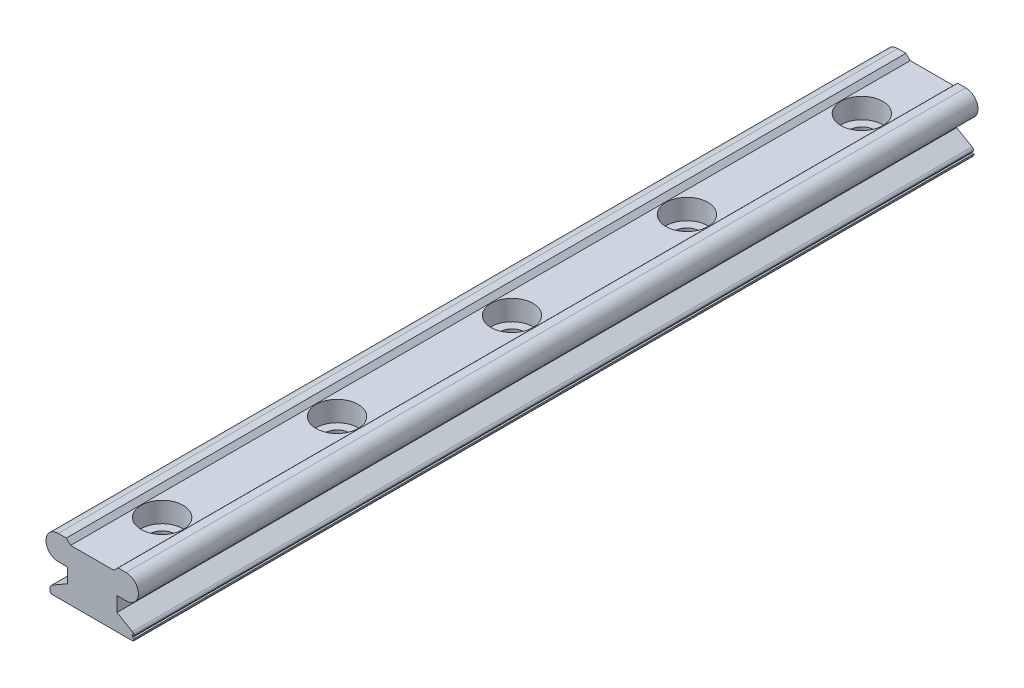
ISO-10303-21;
HEADER;
FILE_DESCRIPTION(('STEP AP214'),'2;1');
FILE_NAME('part.step','',(''),(''),'','','');
FILE_SCHEMA(('AUTOMOTIVE_DESIGN { 1 0 10303 214 1 1 1 1 }'));
ENDSEC;
DATA;
#1=APPLICATION_CONTEXT('core data for automotive mechanical design processes');
#2=APPLICATION_PROTOCOL_DEFINITION('international standard','automotive_design',2000,#1);
#3=PRODUCT_CONTEXT('',#1,'mechanical');
#4=PRODUCT('Part','Part','',(#3));
#5=PRODUCT_RELATED_PRODUCT_CATEGORY('part','',(#4));
#6=PRODUCT_DEFINITION_FORMATION('','',#4);
#7=PRODUCT_DEFINITION_CONTEXT('part definition',#1,'design');
#8=PRODUCT_DEFINITION('design','',#6,#7);
#9=PRODUCT_DEFINITION_SHAPE('','',#8);
#10=(LENGTH_UNIT() NAMED_UNIT(*) SI_UNIT(.MILLI.,.METRE.));
#11=(NAMED_UNIT(*) PLANE_ANGLE_UNIT() SI_UNIT($,.RADIAN.));
#12=(NAMED_UNIT(*) SI_UNIT($,.STERADIAN.) SOLID_ANGLE_UNIT());
#13=UNCERTAINTY_MEASURE_WITH_UNIT(LENGTH_MEASURE(1.E-05),#10,'distance_accuracy_value','');
#14=(GEOMETRIC_REPRESENTATION_CONTEXT(3) GLOBAL_UNCERTAINTY_ASSIGNED_CONTEXT((#13)) GLOBAL_UNIT_ASSIGNED_CONTEXT((#10,
#11,#12)) REPRESENTATION_CONTEXT('',''));
#15=CARTESIAN_POINT('',(0.,0.,0.));
#16=DIRECTION('',(0.,0.,1.));
#17=DIRECTION('',(1.,0.,0.));
#18=AXIS2_PLACEMENT_3D('',#15,#16,#17);
#19=CARTESIAN_POINT('',(5.746,0.,60.));
#20=DIRECTION('',(0.,1.,0.));
#21=DIRECTION('',(0.,0.,1.));
#22=AXIS2_PLACEMENT_3D('',#19,#20,#21);
#23=PLANE('',#22);
#24=CARTESIAN_POINT('',(0.,0.,-25.));
#25=DIRECTION('',(0.,-1.,0.));
#26=DIRECTION('',(0.,0.,-1.));
#27=AXIS2_PLACEMENT_3D('',#24,#25,#26);
#28=CIRCLE('',#27,1.75);
#29=CARTESIAN_POINT('',(0.,0.,-26.75));
#30=VERTEX_POINT('',#29);
#31=EDGE_CURVE('E317',#30,#30,#28,.T.);
#32=ORIENTED_EDGE('',*,*,#31,.F.);
#33=EDGE_LOOP('',(#32));
#34=FACE_BOUND('',#33,.T.);
#35=CARTESIAN_POINT('',(0.,0.,25.));
#36=DIRECTION('',(0.,-1.,0.));
#37=DIRECTION('',(0.,0.,-1.));
#38=AXIS2_PLACEMENT_3D('',#35,#36,#37);
#39=CIRCLE('',#38,1.75);
#40=CARTESIAN_POINT('',(0.,0.,23.25));
#41=VERTEX_POINT('',#40);
#42=EDGE_CURVE('E309',#41,#41,#39,.T.);
#43=ORIENTED_EDGE('',*,*,#42,.F.);
#44=EDGE_LOOP('',(#43));
#45=FACE_BOUND('',#44,.T.);
#46=DIRECTION('',(1.,0.,0.));
#47=VECTOR('',#46,1.);
#48=CARTESIAN_POINT('',(5.746,0.,-60.));
#49=LINE('',#48,#47);
#50=CARTESIAN_POINT('',(-5.746,0.,-60.));
#51=VERTEX_POINT('',#50);
#52=CARTESIAN_POINT('',(5.746,0.,-60.));
#53=VERTEX_POINT('',#52);
#54=EDGE_CURVE('E228',#51,#53,#49,.T.);
#55=ORIENTED_EDGE('',*,*,#54,.T.);
#56=DIRECTION('',(0.,0.,-1.));
#57=VECTOR('',#56,1.);
#58=CARTESIAN_POINT('',(5.746,0.,60.));
#59=LINE('',#58,#57);
#60=CARTESIAN_POINT('',(5.746,0.,60.));
#61=VERTEX_POINT('',#60);
#62=EDGE_CURVE('E278',#61,#53,#59,.T.);
#63=ORIENTED_EDGE('',*,*,#62,.F.);
#64=DIRECTION('',(1.,0.,0.));
#65=VECTOR('',#64,1.);
#66=CARTESIAN_POINT('',(5.746,0.,60.));
#67=LINE('',#66,#65);
#68=CARTESIAN_POINT('',(-5.746,0.,60.));
#69=VERTEX_POINT('',#68);
#70=EDGE_CURVE('E385',#69,#61,#67,.T.);
#71=ORIENTED_EDGE('',*,*,#70,.F.);
#72=DIRECTION('',(0.,0.,-1.));
#73=VECTOR('',#72,1.);
#74=CARTESIAN_POINT('',(-5.746,0.,60.));
#75=LINE('',#74,#73);
#76=EDGE_CURVE('E281',#69,#51,#75,.T.);
#77=ORIENTED_EDGE('',*,*,#76,.T.);
#78=EDGE_LOOP('',(#55,#63,#71,#77));
#79=FACE_BOUND('',#78,.T.);
#80=CARTESIAN_POINT('',(0.,0.,50.));
#81=DIRECTION('',(0.,-1.,0.));
#82=DIRECTION('',(0.,0.,-1.));
#83=AXIS2_PLACEMENT_3D('',#80,#81,#82);
#84=CIRCLE('',#83,1.75);
#85=CARTESIAN_POINT('',(0.,0.,48.25));
#86=VERTEX_POINT('',#85);
#87=EDGE_CURVE('E304',#86,#86,#84,.T.);
#88=ORIENTED_EDGE('',*,*,#87,.F.);
#89=EDGE_LOOP('',(#88));
#90=FACE_BOUND('',#89,.T.);
#91=CARTESIAN_POINT('',(0.,0.,0.));
#92=DIRECTION('',(0.,-1.,0.));
#93=DIRECTION('',(0.,0.,-1.));
#94=AXIS2_PLACEMENT_3D('',#91,#92,#93);
#95=CIRCLE('',#94,1.75);
#96=CARTESIAN_POINT('',(0.,0.,-1.75000000000002));
#97=VERTEX_POINT('',#96);
#98=EDGE_CURVE('E313',#97,#97,#95,.T.);
#99=ORIENTED_EDGE('',*,*,#98,.F.);
#100=EDGE_LOOP('',(#99));
#101=FACE_BOUND('',#100,.T.);
#102=CARTESIAN_POINT('',(0.,0.,-50.));
#103=DIRECTION('',(0.,-1.,0.));
#104=DIRECTION('',(0.,0.,-1.));
#105=AXIS2_PLACEMENT_3D('',#102,#103,#104);
#106=CIRCLE('',#105,1.75);
#107=CARTESIAN_POINT('',(0.,0.,-51.75));
#108=VERTEX_POINT('',#107);
#109=EDGE_CURVE('E699',#108,#108,#106,.T.);
#110=ORIENTED_EDGE('',*,*,#109,.F.);
#111=EDGE_LOOP('',(#110));
#112=FACE_BOUND('',#111,.T.);
#113=ADVANCED_FACE('F33',(#34,#45,#79,#90,#101,#112),#23,.F.);
#114=CARTESIAN_POINT('',(-3.07868181172566,7.4,60.));
#115=DIRECTION('',(0.,-1.,0.));
#116=DIRECTION('',(0.,0.,-1.));
#117=AXIS2_PLACEMENT_3D('',#114,#115,#116);
#118=PLANE('',#117);
#119=CARTESIAN_POINT('',(0.,7.4,-25.));
#120=DIRECTION('',(0.,-1.,0.));
#121=DIRECTION('',(0.,0.,-1.));
#122=AXIS2_PLACEMENT_3D('',#119,#120,#121);
#123=CIRCLE('',#122,3.);
#124=CARTESIAN_POINT('',(0.,7.4,-28.));
#125=VERTEX_POINT('',#124);
#126=EDGE_CURVE('E314',#125,#125,#123,.F.);
#127=ORIENTED_EDGE('',*,*,#126,.F.);
#128=EDGE_LOOP('',(#127));
#129=FACE_BOUND('',#128,.T.);
#130=CARTESIAN_POINT('',(0.,7.4,25.));
#131=DIRECTION('',(0.,-1.,0.));
#132=DIRECTION('',(0.,0.,-1.));
#133=AXIS2_PLACEMENT_3D('',#130,#131,#132);
#134=CIRCLE('',#133,3.);
#135=CARTESIAN_POINT('',(0.,7.4,22.));
#136=VERTEX_POINT('',#135);
#137=EDGE_CURVE('E305',#136,#136,#134,.F.);
#138=ORIENTED_EDGE('',*,*,#137,.F.);
#139=EDGE_LOOP('',(#138));
#140=FACE_BOUND('',#139,.T.);
#141=DIRECTION('',(-1.,0.,0.));
#142=VECTOR('',#141,1.);
#143=CARTESIAN_POINT('',(-3.07868181172566,7.4,-60.));
#144=LINE('',#143,#142);
#145=CARTESIAN_POINT('',(3.07868181172566,7.4,-60.));
#146=VERTEX_POINT('',#145);
#147=CARTESIAN_POINT('',(-3.07868181172566,7.4,-60.));
#148=VERTEX_POINT('',#147);
#149=EDGE_CURVE('E200',#146,#148,#144,.T.);
#150=ORIENTED_EDGE('',*,*,#149,.T.);
#151=DIRECTION('',(0.,0.,-1.));
#152=VECTOR('',#151,1.);
#153=CARTESIAN_POINT('',(-3.07868181172566,7.4,60.));
#154=LINE('',#153,#152);
#155=CARTESIAN_POINT('',(-3.07868181172566,7.4,60.));
#156=VERTEX_POINT('',#155);
#157=EDGE_CURVE('E196',#156,#148,#154,.T.);
#158=ORIENTED_EDGE('',*,*,#157,.F.);
#159=DIRECTION('',(-1.,0.,0.));
#160=VECTOR('',#159,1.);
#161=CARTESIAN_POINT('',(-3.07868181172566,7.4,60.));
#162=LINE('',#161,#160);
#163=CARTESIAN_POINT('',(3.07868181172566,7.4,60.));
#164=VERTEX_POINT('',#163);
#165=EDGE_CURVE('E182',#164,#156,#162,.T.);
#166=ORIENTED_EDGE('',*,*,#165,.F.);
#167=DIRECTION('',(0.,0.,-1.));
#168=VECTOR('',#167,1.);
#169=CARTESIAN_POINT('',(3.07868181172566,7.4,60.));
#170=LINE('',#169,#168);
#171=EDGE_CURVE('E203',#164,#146,#170,.T.);
#172=ORIENTED_EDGE('',*,*,#171,.T.);
#173=EDGE_LOOP('',(#150,#158,#166,#172));
#174=FACE_BOUND('',#173,.T.);
#175=CARTESIAN_POINT('',(0.,7.4,50.));
#176=DIRECTION('',(0.,-1.,0.));
#177=DIRECTION('',(0.,0.,-1.));
#178=AXIS2_PLACEMENT_3D('',#175,#176,#177);
#179=CIRCLE('',#178,3.);
#180=CARTESIAN_POINT('',(0.,7.4,47.));
#181=VERTEX_POINT('',#180);
#182=EDGE_CURVE('E300',#181,#181,#179,.F.);
#183=ORIENTED_EDGE('',*,*,#182,.F.);
#184=EDGE_LOOP('',(#183));
#185=FACE_BOUND('',#184,.T.);
#186=CARTESIAN_POINT('',(0.,7.4,0.));
#187=DIRECTION('',(0.,-1.,0.));
#188=DIRECTION('',(0.,0.,-1.));
#189=AXIS2_PLACEMENT_3D('',#186,#187,#188);
#190=CIRCLE('',#189,3.);
#191=CARTESIAN_POINT('',(0.,7.4,-3.00000000000002));
#192=VERTEX_POINT('',#191);
#193=EDGE_CURVE('E310',#192,#192,#190,.F.);
#194=ORIENTED_EDGE('',*,*,#193,.F.);
#195=EDGE_LOOP('',(#194));
#196=FACE_BOUND('',#195,.T.);
#197=CARTESIAN_POINT('',(0.,7.4,-50.));
#198=DIRECTION('',(0.,-1.,0.));
#199=DIRECTION('',(0.,0.,-1.));
#200=AXIS2_PLACEMENT_3D('',#197,#198,#199);
#201=CIRCLE('',#200,3.);
#202=CARTESIAN_POINT('',(0.,7.4,-53.));
#203=VERTEX_POINT('',#202);
#204=EDGE_CURVE('E37',#203,#203,#201,.F.);
#205=ORIENTED_EDGE('',*,*,#204,.F.);
#206=EDGE_LOOP('',(#205));
#207=FACE_BOUND('',#206,.T.);
#208=ADVANCED_FACE('F197',(#129,#140,#174,#185,#196,#207),#118,.F.);
#209=CARTESIAN_POINT('',(-4.85,6.25,60.));
#210=DIRECTION('',(0.,0.,-1.));
#211=DIRECTION('',(-1.,0.,0.));
#212=AXIS2_PLACEMENT_3D('',#209,#210,#211);
#213=CYLINDRICAL_SURFACE('',#212,1.75);
#214=CARTESIAN_POINT('',(-4.85,6.25,-60.));
#215=DIRECTION('',(0.,0.,1.));
#216=DIRECTION('',(1.,0.,0.));
#217=AXIS2_PLACEMENT_3D('',#214,#215,#216);
#218=CIRCLE('',#217,1.75);
#219=CARTESIAN_POINT('',(-4.85,8.,-60.));
#220=VERTEX_POINT('',#219);
#221=CARTESIAN_POINT('',(-4.85,4.5,-60.));
#222=VERTEX_POINT('',#221);
#223=EDGE_CURVE('E212',#220,#222,#218,.T.);
#224=ORIENTED_EDGE('',*,*,#223,.T.);
#225=DIRECTION('',(0.,0.,-1.));
#226=VECTOR('',#225,1.);
#227=CARTESIAN_POINT('',(-4.85,4.5,60.));
#228=LINE('',#227,#226);
#229=CARTESIAN_POINT('',(-4.85,4.5,60.));
#230=VERTEX_POINT('',#229);
#231=EDGE_CURVE('E42',#230,#222,#228,.T.);
#232=ORIENTED_EDGE('',*,*,#231,.F.);
#233=CARTESIAN_POINT('',(-4.85,6.25,60.));
#234=DIRECTION('',(0.,0.,1.));
#235=DIRECTION('',(1.,0.,0.));
#236=AXIS2_PLACEMENT_3D('',#233,#234,#235);
#237=CIRCLE('',#236,1.75);
#238=CARTESIAN_POINT('',(-4.85,8.,60.));
#239=VERTEX_POINT('',#238);
#240=EDGE_CURVE('E253',#239,#230,#237,.T.);
#241=ORIENTED_EDGE('',*,*,#240,.F.);
#242=DIRECTION('',(0.,0.,-1.));
#243=VECTOR('',#242,1.);
#244=CARTESIAN_POINT('',(-4.85,8.,60.));
#245=LINE('',#244,#243);
#246=EDGE_CURVE('E208',#239,#220,#245,.T.);
#247=ORIENTED_EDGE('',*,*,#246,.T.);
#248=EDGE_LOOP('',(#224,#232,#241,#247));
#249=FACE_BOUND('',#248,.T.);
#250=ADVANCED_FACE('F35',(#249),#213,.T.);
#251=CARTESIAN_POINT('',(-4.85,4.5,60.));
#252=DIRECTION('',(0.,1.,0.));
#253=DIRECTION('',(-1.,0.,0.));
#254=AXIS2_PLACEMENT_3D('',#251,#252,#253);
#255=PLANE('',#254);
#256=DIRECTION('',(1.,0.,0.));
#257=VECTOR('',#256,1.);
#258=CARTESIAN_POINT('',(-4.85,4.5,-60.));
#259=LINE('',#258,#257);
#260=CARTESIAN_POINT('',(-3.55,4.5,-60.));
#261=VERTEX_POINT('',#260);
#262=EDGE_CURVE('E215',#222,#261,#259,.T.);
#263=ORIENTED_EDGE('',*,*,#262,.T.);
#264=DIRECTION('',(0.,0.,-1.));
#265=VECTOR('',#264,1.);
#266=CARTESIAN_POINT('',(-3.55,4.5,60.));
#267=LINE('',#266,#265);
#268=CARTESIAN_POINT('',(-3.55,4.5,60.));
#269=VERTEX_POINT('',#268);
#270=EDGE_CURVE('E296',#269,#261,#267,.T.);
#271=ORIENTED_EDGE('',*,*,#270,.F.);
#272=DIRECTION('',(1.,0.,0.));
#273=VECTOR('',#272,1.);
#274=CARTESIAN_POINT('',(-4.85,4.5,60.));
#275=LINE('',#274,#273);
#276=EDGE_CURVE('E134',#230,#269,#275,.T.);
#277=ORIENTED_EDGE('',*,*,#276,.F.);
#278=ORIENTED_EDGE('',*,*,#231,.T.);
#279=EDGE_LOOP('',(#263,#271,#277,#278));
#280=FACE_BOUND('',#279,.T.);
#281=ADVANCED_FACE('F422',(#280),#255,.F.);
#282=CARTESIAN_POINT('',(-3.55,4.5,60.));
#283=DIRECTION('',(1.,0.,0.));
#284=DIRECTION('',(0.,1.,0.));
#285=AXIS2_PLACEMENT_3D('',#282,#283,#284);
#286=PLANE('',#285);
#287=DIRECTION('',(0.,-1.,0.));
#288=VECTOR('',#287,1.);
#289=CARTESIAN_POINT('',(-3.55,4.5,-60.));
#290=LINE('',#289,#288);
#291=CARTESIAN_POINT('',(-3.55,2.41450815951457,-60.));
#292=VERTEX_POINT('',#291);
#293=EDGE_CURVE('E218',#261,#292,#290,.T.);
#294=ORIENTED_EDGE('',*,*,#293,.T.);
#295=DIRECTION('',(0.,0.,-1.));
#296=VECTOR('',#295,1.);
#297=CARTESIAN_POINT('',(-3.55,2.41450815951457,60.));
#298=LINE('',#297,#296);
#299=CARTESIAN_POINT('',(-3.55,2.41450815951457,60.));
#300=VERTEX_POINT('',#299);
#301=EDGE_CURVE('E293',#300,#292,#298,.T.);
#302=ORIENTED_EDGE('',*,*,#301,.F.);
#303=DIRECTION('',(0.,-1.,0.));
#304=VECTOR('',#303,1.);
#305=CARTESIAN_POINT('',(-3.55,4.5,60.));
#306=LINE('',#305,#304);
#307=EDGE_CURVE('E375',#269,#300,#306,.T.);
#308=ORIENTED_EDGE('',*,*,#307,.F.);
#309=ORIENTED_EDGE('',*,*,#270,.T.);
#310=EDGE_LOOP('',(#294,#302,#308,#309));
#311=FACE_BOUND('',#310,.T.);
#312=ADVANCED_FACE('F425',(#311),#286,.F.);
#313=CARTESIAN_POINT('',(-3.55,2.41450815951457,60.));
#314=DIRECTION('',(0.499999999999996,-0.866025403784441,0.));
#315=DIRECTION('',(0.866025403784441,0.499999999999996,0.));
#316=AXIS2_PLACEMENT_3D('',#313,#314,#315);
#317=PLANE('',#316);
#318=DIRECTION('',(-0.866025403784441,-0.499999999999996,0.));
#319=VECTOR('',#318,1.);
#320=CARTESIAN_POINT('',(-3.55,2.41450815951457,-60.));
#321=LINE('',#320,#319);
#322=CARTESIAN_POINT('',(-5.746,1.14664696837416,-60.));
#323=VERTEX_POINT('',#322);
#324=EDGE_CURVE('E220',#292,#323,#321,.T.);
#325=ORIENTED_EDGE('',*,*,#324,.T.);
#326=DIRECTION('',(0.,0.,-1.));
#327=VECTOR('',#326,1.);
#328=CARTESIAN_POINT('',(-5.746,1.14664696837416,60.));
#329=LINE('',#328,#327);
#330=CARTESIAN_POINT('',(-5.746,1.14664696837416,60.));
#331=VERTEX_POINT('',#330);
#332=EDGE_CURVE('E290',#331,#323,#329,.T.);
#333=ORIENTED_EDGE('',*,*,#332,.F.);
#334=DIRECTION('',(-0.866025403784441,-0.499999999999996,0.));
#335=VECTOR('',#334,1.);
#336=CARTESIAN_POINT('',(-3.55,2.41450815951457,60.));
#337=LINE('',#336,#335);
#338=EDGE_CURVE('E377',#300,#331,#337,.T.);
#339=ORIENTED_EDGE('',*,*,#338,.F.);
#340=ORIENTED_EDGE('',*,*,#301,.T.);
#341=EDGE_LOOP('',(#325,#333,#339,#340));
#342=FACE_BOUND('',#341,.T.);
#343=ADVANCED_FACE('F430',(#342),#317,.F.);
#344=CARTESIAN_POINT('',(-5.492,0.706706063251668,60.));
#345=DIRECTION('',(0.,0.,-1.));
#346=DIRECTION('',(-1.,0.,0.));
#347=AXIS2_PLACEMENT_3D('',#344,#345,#346);
#348=CYLINDRICAL_SURFACE('',#347,0.508);
#349=CARTESIAN_POINT('',(-5.492,0.706706063251668,-60.));
#350=DIRECTION('',(0.,0.,1.));
#351=DIRECTION('',(-1.,0.,0.));
#352=AXIS2_PLACEMENT_3D('',#349,#350,#351);
#353=CIRCLE('',#352,0.508);
#354=CARTESIAN_POINT('',(-6.,0.706706063251669,-60.));
#355=VERTEX_POINT('',#354);
#356=EDGE_CURVE('E222',#323,#355,#353,.T.);
#357=ORIENTED_EDGE('',*,*,#356,.T.);
#358=DIRECTION('',(0.,0.,-1.));
#359=VECTOR('',#358,1.);
#360=CARTESIAN_POINT('',(-6.,0.706706063251669,60.));
#361=LINE('',#360,#359);
#362=CARTESIAN_POINT('',(-6.,0.706706063251669,60.));
#363=VERTEX_POINT('',#362);
#364=EDGE_CURVE('E287',#363,#355,#361,.T.);
#365=ORIENTED_EDGE('',*,*,#364,.F.);
#366=CARTESIAN_POINT('',(-5.492,0.706706063251668,60.));
#367=DIRECTION('',(0.,0.,1.));
#368=DIRECTION('',(-1.,0.,0.));
#369=AXIS2_PLACEMENT_3D('',#366,#367,#368);
#370=CIRCLE('',#369,0.508);
#371=EDGE_CURVE('E379',#331,#363,#370,.T.);
#372=ORIENTED_EDGE('',*,*,#371,.F.);
#373=ORIENTED_EDGE('',*,*,#332,.T.);
#374=EDGE_LOOP('',(#357,#365,#372,#373));
#375=FACE_BOUND('',#374,.T.);
#376=ADVANCED_FACE('F436',(#375),#348,.T.);
#377=CARTESIAN_POINT('',(-6.,0.253999999999999,60.));
#378=DIRECTION('',(1.,0.,0.));
#379=DIRECTION('',(0.,1.,0.));
#380=AXIS2_PLACEMENT_3D('',#377,#378,#379);
#381=PLANE('',#380);
#382=DIRECTION('',(0.,-1.,0.));
#383=VECTOR('',#382,1.);
#384=CARTESIAN_POINT('',(-6.,0.253999999999999,-60.));
#385=LINE('',#384,#383);
#386=CARTESIAN_POINT('',(-6.,0.253999999999999,-60.));
#387=VERTEX_POINT('',#386);
#388=EDGE_CURVE('E224',#355,#387,#385,.T.);
#389=ORIENTED_EDGE('',*,*,#388,.T.);
#390=DIRECTION('',(0.,0.,-1.));
#391=VECTOR('',#390,1.);
#392=CARTESIAN_POINT('',(-6.,0.253999999999999,60.));
#393=LINE('',#392,#391);
#394=CARTESIAN_POINT('',(-6.,0.253999999999999,60.));
#395=VERTEX_POINT('',#394);
#396=EDGE_CURVE('E284',#395,#387,#393,.T.);
#397=ORIENTED_EDGE('',*,*,#396,.F.);
#398=DIRECTION('',(0.,-1.,0.));
#399=VECTOR('',#398,1.);
#400=CARTESIAN_POINT('',(-6.,0.253999999999999,60.));
#401=LINE('',#400,#399);
#402=EDGE_CURVE('E381',#363,#395,#401,.T.);
#403=ORIENTED_EDGE('',*,*,#402,.F.);
#404=ORIENTED_EDGE('',*,*,#364,.T.);
#405=EDGE_LOOP('',(#389,#397,#403,#404));
#406=FACE_BOUND('',#405,.T.);
#407=ADVANCED_FACE('F440',(#406),#381,.F.);
#408=CARTESIAN_POINT('',(-5.746,0.253999999999999,60.));
#409=DIRECTION('',(0.,0.,-1.));
#410=DIRECTION('',(-1.,0.,0.));
#411=AXIS2_PLACEMENT_3D('',#408,#409,#410);
#412=CYLINDRICAL_SURFACE('',#411,0.254);
#413=CARTESIAN_POINT('',(-5.746,0.253999999999999,-60.));
#414=DIRECTION('',(0.,0.,1.));
#415=DIRECTION('',(-1.,0.,0.));
#416=AXIS2_PLACEMENT_3D('',#413,#414,#415);
#417=CIRCLE('',#416,0.254);
#418=EDGE_CURVE('E226',#387,#51,#417,.T.);
#419=ORIENTED_EDGE('',*,*,#418,.T.);
#420=ORIENTED_EDGE('',*,*,#76,.F.);
#421=CARTESIAN_POINT('',(-5.746,0.253999999999999,60.));
#422=DIRECTION('',(0.,0.,1.));
#423=DIRECTION('',(-1.,0.,0.));
#424=AXIS2_PLACEMENT_3D('',#421,#422,#423);
#425=CIRCLE('',#424,0.254);
#426=EDGE_CURVE('E383',#395,#69,#425,.T.);
#427=ORIENTED_EDGE('',*,*,#426,.F.);
#428=ORIENTED_EDGE('',*,*,#396,.T.);
#429=EDGE_LOOP('',(#419,#420,#427,#428));
#430=FACE_BOUND('',#429,.T.);
#431=ADVANCED_FACE('F445',(#430),#412,.T.);
#432=CARTESIAN_POINT('',(5.746,0.253999999999999,60.));
#433=DIRECTION('',(0.,0.,-1.));
#434=DIRECTION('',(-1.,0.,0.));
#435=AXIS2_PLACEMENT_3D('',#432,#433,#434);
#436=CYLINDRICAL_SURFACE('',#435,0.254);
#437=CARTESIAN_POINT('',(5.746,0.253999999999999,-60.));
#438=DIRECTION('',(0.,0.,1.));
#439=DIRECTION('',(1.,0.,0.));
#440=AXIS2_PLACEMENT_3D('',#437,#438,#439);
#441=CIRCLE('',#440,0.254);
#442=CARTESIAN_POINT('',(6.,0.253999999999999,-60.));
#443=VERTEX_POINT('',#442);
#444=EDGE_CURVE('E230',#53,#443,#441,.T.);
#445=ORIENTED_EDGE('',*,*,#444,.T.);
#446=DIRECTION('',(0.,0.,-1.));
#447=VECTOR('',#446,1.);
#448=CARTESIAN_POINT('',(6.,0.253999999999999,60.));
#449=LINE('',#448,#447);
#450=CARTESIAN_POINT('',(6.,0.253999999999999,60.));
#451=VERTEX_POINT('',#450);
#452=EDGE_CURVE('E275',#451,#443,#449,.T.);
#453=ORIENTED_EDGE('',*,*,#452,.F.);
#454=CARTESIAN_POINT('',(5.746,0.253999999999999,60.));
#455=DIRECTION('',(0.,0.,1.));
#456=DIRECTION('',(1.,0.,0.));
#457=AXIS2_PLACEMENT_3D('',#454,#455,#456);
#458=CIRCLE('',#457,0.254);
#459=EDGE_CURVE('E387',#61,#451,#458,.T.);
#460=ORIENTED_EDGE('',*,*,#459,.F.);
#461=ORIENTED_EDGE('',*,*,#62,.T.);
#462=EDGE_LOOP('',(#445,#453,#460,#461));
#463=FACE_BOUND('',#462,.T.);
#464=ADVANCED_FACE('F455',(#463),#436,.T.);
#465=CARTESIAN_POINT('',(6.,0.706706063251669,60.));
#466=DIRECTION('',(-1.,0.,0.));
#467=DIRECTION('',(0.,0.,1.));
#468=AXIS2_PLACEMENT_3D('',#465,#466,#467);
#469=PLANE('',#468);
#470=DIRECTION('',(0.,1.,0.));
#471=VECTOR('',#470,1.);
#472=CARTESIAN_POINT('',(6.,0.706706063251669,-60.));
#473=LINE('',#472,#471);
#474=CARTESIAN_POINT('',(6.,0.406399999999999,-60.));
#475=VERTEX_POINT('',#474);
#476=EDGE_CURVE('E232',#443,#475,#473,.T.);
#477=ORIENTED_EDGE('',*,*,#476,.T.);
#478=DIRECTION('',(0.,0.,1.));
#479=VECTOR('',#478,1.);
#480=CARTESIAN_POINT('',(6.,0.406399999999999,-60.));
#481=LINE('',#480,#479);
#482=CARTESIAN_POINT('',(6.,0.406399999999999,60.));
#483=VERTEX_POINT('',#482);
#484=EDGE_CURVE('E364',#475,#483,#481,.T.);
#485=ORIENTED_EDGE('',*,*,#484,.T.);
#486=DIRECTION('',(0.,1.,0.));
#487=VECTOR('',#486,1.);
#488=CARTESIAN_POINT('',(6.,0.706706063251669,60.));
#489=LINE('',#488,#487);
#490=EDGE_CURVE('E389',#451,#483,#489,.T.);
#491=ORIENTED_EDGE('',*,*,#490,.F.);
#492=ORIENTED_EDGE('',*,*,#452,.T.);
#493=EDGE_LOOP('',(#477,#485,#491,#492));
#494=FACE_BOUND('',#493,.T.);
#495=ADVANCED_FACE('F459',(#494),#469,.F.);
#496=CARTESIAN_POINT('',(5.492,0.706706063251669,60.));
#497=DIRECTION('',(0.,0.,-1.));
#498=DIRECTION('',(-1.,0.,0.));
#499=AXIS2_PLACEMENT_3D('',#496,#497,#498);
#500=CYLINDRICAL_SURFACE('',#499,0.508);
#501=CARTESIAN_POINT('',(5.492,0.706706063251669,60.));
#502=DIRECTION('',(0.,0.,1.));
#503=DIRECTION('',(1.,0.,0.));
#504=AXIS2_PLACEMENT_3D('',#501,#502,#503);
#505=CIRCLE('',#504,0.508);
#506=CARTESIAN_POINT('',(5.99355008580605,0.787399999999999,60.));
#507=VERTEX_POINT('',#506);
#508=CARTESIAN_POINT('',(5.746,1.14664696837417,60.));
#509=VERTEX_POINT('',#508);
#510=EDGE_CURVE('E392',#507,#509,#505,.T.);
#511=ORIENTED_EDGE('',*,*,#510,.F.);
#512=DIRECTION('',(0.,0.,-1.));
#513=VECTOR('',#512,1.);
#514=CARTESIAN_POINT('',(5.99355008580605,0.787399999999999,60.));
#515=LINE('',#514,#513);
#516=CARTESIAN_POINT('',(5.99355008580605,0.787399999999999,-60.));
#517=VERTEX_POINT('',#516);
#518=EDGE_CURVE('E216',#507,#517,#515,.T.);
#519=ORIENTED_EDGE('',*,*,#518,.T.);
#520=CARTESIAN_POINT('',(5.492,0.706706063251669,-60.));
#521=DIRECTION('',(0.,0.,1.));
#522=DIRECTION('',(1.,0.,0.));
#523=AXIS2_PLACEMENT_3D('',#520,#521,#522);
#524=CIRCLE('',#523,0.508);
#525=CARTESIAN_POINT('',(5.746,1.14664696837417,-60.));
#526=VERTEX_POINT('',#525);
#527=EDGE_CURVE('E235',#517,#526,#524,.T.);
#528=ORIENTED_EDGE('',*,*,#527,.T.);
#529=DIRECTION('',(0.,0.,-1.));
#530=VECTOR('',#529,1.);
#531=CARTESIAN_POINT('',(5.746,1.14664696837417,60.));
#532=LINE('',#531,#530);
#533=EDGE_CURVE('E272',#509,#526,#532,.T.);
#534=ORIENTED_EDGE('',*,*,#533,.F.);
#535=EDGE_LOOP('',(#511,#519,#528,#534));
#536=FACE_BOUND('',#535,.T.);
#537=ADVANCED_FACE('F482',(#536),#500,.T.);
#538=CARTESIAN_POINT('',(3.55,2.41450815951457,60.));
#539=DIRECTION('',(-0.499999999999995,-0.866025403784442,0.));
#540=DIRECTION('',(0.866025403784442,-0.499999999999995,0.));
#541=AXIS2_PLACEMENT_3D('',#538,#539,#540);
#542=PLANE('',#541);
#543=DIRECTION('',(-0.866025403784442,0.499999999999995,0.));
#544=VECTOR('',#543,1.);
#545=CARTESIAN_POINT('',(3.55,2.41450815951457,-60.));
#546=LINE('',#545,#544);
#547=CARTESIAN_POINT('',(3.55,2.41450815951457,-60.));
#548=VERTEX_POINT('',#547);
#549=EDGE_CURVE('E237',#526,#548,#546,.T.);
#550=ORIENTED_EDGE('',*,*,#549,.T.);
#551=DIRECTION('',(0.,0.,-1.));
#552=VECTOR('',#551,1.);
#553=CARTESIAN_POINT('',(3.55,2.41450815951457,60.));
#554=LINE('',#553,#552);
#555=CARTESIAN_POINT('',(3.55,2.41450815951457,60.));
#556=VERTEX_POINT('',#555);
#557=EDGE_CURVE('E269',#556,#548,#554,.T.);
#558=ORIENTED_EDGE('',*,*,#557,.F.);
#559=DIRECTION('',(-0.866025403784442,0.499999999999995,0.));
#560=VECTOR('',#559,1.);
#561=CARTESIAN_POINT('',(3.55,2.41450815951457,60.));
#562=LINE('',#561,#560);
#563=EDGE_CURVE('E394',#509,#556,#562,.T.);
#564=ORIENTED_EDGE('',*,*,#563,.F.);
#565=ORIENTED_EDGE('',*,*,#533,.T.);
#566=EDGE_LOOP('',(#550,#558,#564,#565));
#567=FACE_BOUND('',#566,.T.);
#568=ADVANCED_FACE('F489',(#567),#542,.F.);
#569=CARTESIAN_POINT('',(3.55,4.5,60.));
#570=DIRECTION('',(-1.,0.,0.));
#571=DIRECTION('',(0.,0.,1.));
#572=AXIS2_PLACEMENT_3D('',#569,#570,#571);
#573=PLANE('',#572);
#574=DIRECTION('',(0.,1.,0.));
#575=VECTOR('',#574,1.);
#576=CARTESIAN_POINT('',(3.55,4.5,-60.));
#577=LINE('',#576,#575);
#578=CARTESIAN_POINT('',(3.55,4.5,-60.));
#579=VERTEX_POINT('',#578);
#580=EDGE_CURVE('E239',#548,#579,#577,.T.);
#581=ORIENTED_EDGE('',*,*,#580,.T.);
#582=DIRECTION('',(0.,0.,-1.));
#583=VECTOR('',#582,1.);
#584=CARTESIAN_POINT('',(3.55,4.5,60.));
#585=LINE('',#584,#583);
#586=CARTESIAN_POINT('',(3.55,4.5,60.));
#587=VERTEX_POINT('',#586);
#588=EDGE_CURVE('E266',#587,#579,#585,.T.);
#589=ORIENTED_EDGE('',*,*,#588,.F.);
#590=DIRECTION('',(0.,1.,0.));
#591=VECTOR('',#590,1.);
#592=CARTESIAN_POINT('',(3.55,4.5,60.));
#593=LINE('',#592,#591);
#594=EDGE_CURVE('E396',#556,#587,#593,.T.);
#595=ORIENTED_EDGE('',*,*,#594,.F.);
#596=ORIENTED_EDGE('',*,*,#557,.T.);
#597=EDGE_LOOP('',(#581,#589,#595,#596));
#598=FACE_BOUND('',#597,.T.);
#599=ADVANCED_FACE('F493',(#598),#573,.F.);
#600=CARTESIAN_POINT('',(4.85,4.5,60.));
#601=DIRECTION('',(0.,1.,0.));
#602=DIRECTION('',(-1.,0.,0.));
#603=AXIS2_PLACEMENT_3D('',#600,#601,#602);
#604=PLANE('',#603);
#605=DIRECTION('',(1.,0.,0.));
#606=VECTOR('',#605,1.);
#607=CARTESIAN_POINT('',(4.85,4.5,-60.));
#608=LINE('',#607,#606);
#609=CARTESIAN_POINT('',(4.85,4.5,-60.));
#610=VERTEX_POINT('',#609);
#611=EDGE_CURVE('E241',#579,#610,#608,.T.);
#612=ORIENTED_EDGE('',*,*,#611,.T.);
#613=DIRECTION('',(0.,0.,-1.));
#614=VECTOR('',#613,1.);
#615=CARTESIAN_POINT('',(4.85,4.5,60.));
#616=LINE('',#615,#614);
#617=CARTESIAN_POINT('',(4.85,4.5,60.));
#618=VERTEX_POINT('',#617);
#619=EDGE_CURVE('E263',#618,#610,#616,.T.);
#620=ORIENTED_EDGE('',*,*,#619,.F.);
#621=DIRECTION('',(1.,0.,0.));
#622=VECTOR('',#621,1.);
#623=CARTESIAN_POINT('',(4.85,4.5,60.));
#624=LINE('',#623,#622);
#625=EDGE_CURVE('E398',#587,#618,#624,.T.);
#626=ORIENTED_EDGE('',*,*,#625,.F.);
#627=ORIENTED_EDGE('',*,*,#588,.T.);
#628=EDGE_LOOP('',(#612,#620,#626,#627));
#629=FACE_BOUND('',#628,.T.);
#630=ADVANCED_FACE('F828',(#629),#604,.F.);
#631=CARTESIAN_POINT('',(4.85,6.25,60.));
#632=DIRECTION('',(0.,0.,-1.));
#633=DIRECTION('',(-1.,0.,0.));
#634=AXIS2_PLACEMENT_3D('',#631,#632,#633);
#635=CYLINDRICAL_SURFACE('',#634,1.75);
#636=CARTESIAN_POINT('',(4.85,6.25,-60.));
#637=DIRECTION('',(0.,0.,1.));
#638=DIRECTION('',(-1.,0.,0.));
#639=AXIS2_PLACEMENT_3D('',#636,#637,#638);
#640=CIRCLE('',#639,1.75);
#641=CARTESIAN_POINT('',(4.85,8.,-60.));
#642=VERTEX_POINT('',#641);
#643=EDGE_CURVE('E243',#610,#642,#640,.T.);
#644=ORIENTED_EDGE('',*,*,#643,.T.);
#645=DIRECTION('',(0.,0.,-1.));
#646=VECTOR('',#645,1.);
#647=CARTESIAN_POINT('',(4.85,8.,60.));
#648=LINE('',#647,#646);
#649=CARTESIAN_POINT('',(4.85,8.,60.));
#650=VERTEX_POINT('',#649);
#651=EDGE_CURVE('E260',#650,#642,#648,.T.);
#652=ORIENTED_EDGE('',*,*,#651,.F.);
#653=CARTESIAN_POINT('',(4.85,6.25,60.));
#654=DIRECTION('',(0.,0.,1.));
#655=DIRECTION('',(-1.,0.,0.));
#656=AXIS2_PLACEMENT_3D('',#653,#654,#655);
#657=CIRCLE('',#656,1.75);
#658=EDGE_CURVE('E400',#618,#650,#657,.T.);
#659=ORIENTED_EDGE('',*,*,#658,.F.);
#660=ORIENTED_EDGE('',*,*,#619,.T.);
#661=EDGE_LOOP('',(#644,#652,#659,#660));
#662=FACE_BOUND('',#661,.T.);
#663=ADVANCED_FACE('F819',(#662),#635,.T.);
#664=CARTESIAN_POINT('',(3.7,8.,60.));
#665=DIRECTION('',(0.,-1.,0.));
#666=DIRECTION('',(1.,0.,0.));
#667=AXIS2_PLACEMENT_3D('',#664,#665,#666);
#668=PLANE('',#667);
#669=DIRECTION('',(-1.,0.,0.));
#670=VECTOR('',#669,1.);
#671=CARTESIAN_POINT('',(3.7,8.,-60.));
#672=LINE('',#671,#670);
#673=CARTESIAN_POINT('',(3.7,8.,-60.));
#674=VERTEX_POINT('',#673);
#675=EDGE_CURVE('E245',#642,#674,#672,.T.);
#676=ORIENTED_EDGE('',*,*,#675,.T.);
#677=DIRECTION('',(0.,0.,-1.));
#678=VECTOR('',#677,1.);
#679=CARTESIAN_POINT('',(3.7,8.,60.));
#680=LINE('',#679,#678);
#681=CARTESIAN_POINT('',(3.7,8.,60.));
#682=VERTEX_POINT('',#681);
#683=EDGE_CURVE('E257',#682,#674,#680,.T.);
#684=ORIENTED_EDGE('',*,*,#683,.F.);
#685=DIRECTION('',(-1.,0.,0.));
#686=VECTOR('',#685,1.);
#687=CARTESIAN_POINT('',(3.7,8.,60.));
#688=LINE('',#687,#686);
#689=EDGE_CURVE('E402',#650,#682,#688,.T.);
#690=ORIENTED_EDGE('',*,*,#689,.F.);
#691=ORIENTED_EDGE('',*,*,#651,.T.);
#692=EDGE_LOOP('',(#676,#684,#690,#691));
#693=FACE_BOUND('',#692,.T.);
#694=ADVANCED_FACE('F408',(#693),#668,.F.);
#695=CARTESIAN_POINT('',(3.07868181172566,7.4,60.));
#696=DIRECTION('',(0.694658370458997,-0.719339800338651,0.));
#697=DIRECTION('',(0.719339800338651,0.694658370458997,0.));
#698=AXIS2_PLACEMENT_3D('',#695,#696,#697);
#699=PLANE('',#698);
#700=DIRECTION('',(-0.719339800338651,-0.694658370458997,0.));
#701=VECTOR('',#700,1.);
#702=CARTESIAN_POINT('',(3.07868181172566,7.4,-60.));
#703=LINE('',#702,#701);
#704=EDGE_CURVE('E247',#674,#146,#703,.T.);
#705=ORIENTED_EDGE('',*,*,#704,.T.);
#706=ORIENTED_EDGE('',*,*,#171,.F.);
#707=DIRECTION('',(-0.719339800338651,-0.694658370458997,0.));
#708=VECTOR('',#707,1.);
#709=CARTESIAN_POINT('',(3.07868181172566,7.4,60.));
#710=LINE('',#709,#708);
#711=EDGE_CURVE('E190',#682,#164,#710,.T.);
#712=ORIENTED_EDGE('',*,*,#711,.F.);
#713=ORIENTED_EDGE('',*,*,#683,.T.);
#714=EDGE_LOOP('',(#705,#706,#712,#713));
#715=FACE_BOUND('',#714,.T.);
#716=ADVANCED_FACE('F412',(#715),#699,.F.);
#717=CARTESIAN_POINT('',(-3.7,8.,60.));
#718=DIRECTION('',(-0.694658370458997,-0.719339800338651,0.));
#719=DIRECTION('',(0.719339800338651,-0.694658370458997,0.));
#720=AXIS2_PLACEMENT_3D('',#717,#718,#719);
#721=PLANE('',#720);
#722=DIRECTION('',(-0.719339800338651,0.694658370458997,0.));
#723=VECTOR('',#722,1.);
#724=CARTESIAN_POINT('',(-3.7,8.,-60.));
#725=LINE('',#724,#723);
#726=CARTESIAN_POINT('',(-3.7,8.,-60.));
#727=VERTEX_POINT('',#726);
#728=EDGE_CURVE('E250',#148,#727,#725,.T.);
#729=ORIENTED_EDGE('',*,*,#728,.T.);
#730=DIRECTION('',(0.,0.,-1.));
#731=VECTOR('',#730,1.);
#732=CARTESIAN_POINT('',(-3.7,8.,60.));
#733=LINE('',#732,#731);
#734=CARTESIAN_POINT('',(-3.7,8.,60.));
#735=VERTEX_POINT('',#734);
#736=EDGE_CURVE('E204',#735,#727,#733,.T.);
#737=ORIENTED_EDGE('',*,*,#736,.F.);
#738=DIRECTION('',(-0.719339800338651,0.694658370458997,0.));
#739=VECTOR('',#738,1.);
#740=CARTESIAN_POINT('',(-3.7,8.,60.));
#741=LINE('',#740,#739);
#742=EDGE_CURVE('E187',#156,#735,#741,.T.);
#743=ORIENTED_EDGE('',*,*,#742,.F.);
#744=ORIENTED_EDGE('',*,*,#157,.T.);
#745=EDGE_LOOP('',(#729,#737,#743,#744));
#746=FACE_BOUND('',#745,.T.);
#747=ADVANCED_FACE('F206',(#746),#721,.F.);
#748=CARTESIAN_POINT('',(-4.85,8.,60.));
#749=DIRECTION('',(0.,-1.,0.));
#750=DIRECTION('',(1.,0.,0.));
#751=AXIS2_PLACEMENT_3D('',#748,#749,#750);
#752=PLANE('',#751);
#753=DIRECTION('',(-1.,0.,0.));
#754=VECTOR('',#753,1.);
#755=CARTESIAN_POINT('',(-4.85,8.,-60.));
#756=LINE('',#755,#754);
#757=EDGE_CURVE('E125',#727,#220,#756,.T.);
#758=ORIENTED_EDGE('',*,*,#757,.T.);
#759=ORIENTED_EDGE('',*,*,#246,.F.);
#760=DIRECTION('',(-1.,0.,0.));
#761=VECTOR('',#760,1.);
#762=CARTESIAN_POINT('',(-4.85,8.,60.));
#763=LINE('',#762,#761);
#764=EDGE_CURVE('E59',#735,#239,#763,.T.);
#765=ORIENTED_EDGE('',*,*,#764,.F.);
#766=ORIENTED_EDGE('',*,*,#736,.T.);
#767=EDGE_LOOP('',(#758,#759,#765,#766));
#768=FACE_BOUND('',#767,.T.);
#769=ADVANCED_FACE('F416',(#768),#752,.F.);
#770=CARTESIAN_POINT('',(-4.85,6.25,60.));
#771=DIRECTION('',(0.,0.,1.));
#772=DIRECTION('',(1.,0.,0.));
#773=AXIS2_PLACEMENT_3D('',#770,#771,#772);
#774=PLANE('',#773);
#775=DIRECTION('',(1.,0.,0.));
#776=VECTOR('',#775,1.);
#777=CARTESIAN_POINT('',(6.,0.406399999999999,60.));
#778=LINE('',#777,#776);
#779=CARTESIAN_POINT('',(5.746,0.406399999999999,60.));
#780=VERTEX_POINT('',#779);
#781=EDGE_CURVE('E356',#780,#483,#778,.T.);
#782=ORIENTED_EDGE('',*,*,#781,.F.);
#783=DIRECTION('',(0.,-1.,0.));
#784=VECTOR('',#783,1.);
#785=CARTESIAN_POINT('',(5.746,0.406399999999999,60.));
#786=LINE('',#785,#784);
#787=CARTESIAN_POINT('',(5.746,0.787399999999999,60.));
#788=VERTEX_POINT('',#787);
#789=EDGE_CURVE('E353',#788,#780,#786,.T.);
#790=ORIENTED_EDGE('',*,*,#789,.F.);
#791=DIRECTION('',(-1.,0.,0.));
#792=VECTOR('',#791,1.);
#793=CARTESIAN_POINT('',(6.,0.787399999999999,60.));
#794=LINE('',#793,#792);
#795=EDGE_CURVE('E303',#507,#788,#794,.T.);
#796=ORIENTED_EDGE('',*,*,#795,.F.);
#797=ORIENTED_EDGE('',*,*,#510,.T.);
#798=ORIENTED_EDGE('',*,*,#563,.T.);
#799=ORIENTED_EDGE('',*,*,#594,.T.);
#800=ORIENTED_EDGE('',*,*,#625,.T.);
#801=ORIENTED_EDGE('',*,*,#658,.T.);
#802=ORIENTED_EDGE('',*,*,#689,.T.);
#803=ORIENTED_EDGE('',*,*,#711,.T.);
#804=ORIENTED_EDGE('',*,*,#165,.T.);
#805=ORIENTED_EDGE('',*,*,#742,.T.);
#806=ORIENTED_EDGE('',*,*,#764,.T.);
#807=ORIENTED_EDGE('',*,*,#240,.T.);
#808=ORIENTED_EDGE('',*,*,#276,.T.);
#809=ORIENTED_EDGE('',*,*,#307,.T.);
#810=ORIENTED_EDGE('',*,*,#338,.T.);
#811=ORIENTED_EDGE('',*,*,#371,.T.);
#812=ORIENTED_EDGE('',*,*,#402,.T.);
#813=ORIENTED_EDGE('',*,*,#426,.T.);
#814=ORIENTED_EDGE('',*,*,#70,.T.);
#815=ORIENTED_EDGE('',*,*,#459,.T.);
#816=ORIENTED_EDGE('',*,*,#490,.T.);
#817=EDGE_LOOP('',(#782,#790,#796,#797,#798,#799,#800,#801,#802,#803,#804,#805,#806,#807,#808,
#809,#810,#811,#812,#813,#814,#815,#816));
#818=FACE_BOUND('',#817,.T.);
#819=ADVANCED_FACE('F185',(#818),#774,.T.);
#820=CARTESIAN_POINT('',(-4.85,6.25,-60.));
#821=DIRECTION('',(0.,0.,1.));
#822=DIRECTION('',(1.,0.,0.));
#823=AXIS2_PLACEMENT_3D('',#820,#821,#822);
#824=PLANE('',#823);
#825=DIRECTION('',(0.,-1.,0.));
#826=VECTOR('',#825,1.);
#827=CARTESIAN_POINT('',(5.746,0.406399999999999,-60.));
#828=LINE('',#827,#826);
#829=CARTESIAN_POINT('',(5.746,0.787399999999999,-60.));
#830=VERTEX_POINT('',#829);
#831=CARTESIAN_POINT('',(5.746,0.406399999999999,-60.));
#832=VERTEX_POINT('',#831);
#833=EDGE_CURVE('E50',#830,#832,#828,.T.);
#834=ORIENTED_EDGE('',*,*,#833,.T.);
#835=DIRECTION('',(1.,0.,0.));
#836=VECTOR('',#835,1.);
#837=CARTESIAN_POINT('',(6.,0.406399999999999,-60.));
#838=LINE('',#837,#836);
#839=EDGE_CURVE('E360',#832,#475,#838,.T.);
#840=ORIENTED_EDGE('',*,*,#839,.T.);
#841=ORIENTED_EDGE('',*,*,#476,.F.);
#842=ORIENTED_EDGE('',*,*,#444,.F.);
#843=ORIENTED_EDGE('',*,*,#54,.F.);
#844=ORIENTED_EDGE('',*,*,#418,.F.);
#845=ORIENTED_EDGE('',*,*,#388,.F.);
#846=ORIENTED_EDGE('',*,*,#356,.F.);
#847=ORIENTED_EDGE('',*,*,#324,.F.);
#848=ORIENTED_EDGE('',*,*,#293,.F.);
#849=ORIENTED_EDGE('',*,*,#262,.F.);
#850=ORIENTED_EDGE('',*,*,#223,.F.);
#851=ORIENTED_EDGE('',*,*,#757,.F.);
#852=ORIENTED_EDGE('',*,*,#728,.F.);
#853=ORIENTED_EDGE('',*,*,#149,.F.);
#854=ORIENTED_EDGE('',*,*,#704,.F.);
#855=ORIENTED_EDGE('',*,*,#675,.F.);
#856=ORIENTED_EDGE('',*,*,#643,.F.);
#857=ORIENTED_EDGE('',*,*,#611,.F.);
#858=ORIENTED_EDGE('',*,*,#580,.F.);
#859=ORIENTED_EDGE('',*,*,#549,.F.);
#860=ORIENTED_EDGE('',*,*,#527,.F.);
#861=DIRECTION('',(-1.,0.,0.));
#862=VECTOR('',#861,1.);
#863=CARTESIAN_POINT('',(-4.85,0.787399999999999,-60.));
#864=LINE('',#863,#862);
#865=EDGE_CURVE('E12',#517,#830,#864,.T.);
#866=ORIENTED_EDGE('',*,*,#865,.T.);
#867=EDGE_LOOP('',(#834,#840,#841,#842,#843,#844,#845,#846,#847,#848,#849,#850,#851,#852,#853,
#854,#855,#856,#857,#858,#859,#860,#866));
#868=FACE_BOUND('',#867,.T.);
#869=ADVANCED_FACE('F414',(#868),#824,.F.);
#870=CARTESIAN_POINT('',(6.,0.787399999999999,-60.));
#871=DIRECTION('',(0.,1.,0.));
#872=DIRECTION('',(0.,0.,1.));
#873=AXIS2_PLACEMENT_3D('',#870,#871,#872);
#874=PLANE('',#873);
#875=ORIENTED_EDGE('',*,*,#795,.T.);
#876=DIRECTION('',(0.,0.,1.));
#877=VECTOR('',#876,1.);
#878=CARTESIAN_POINT('',(5.746,0.787399999999999,-60.));
#879=LINE('',#878,#877);
#880=EDGE_CURVE('E363',#830,#788,#879,.T.);
#881=ORIENTED_EDGE('',*,*,#880,.F.);
#882=ORIENTED_EDGE('',*,*,#865,.F.);
#883=ORIENTED_EDGE('',*,*,#518,.F.);
#884=EDGE_LOOP('',(#875,#881,#882,#883));
#885=FACE_BOUND('',#884,.T.);
#886=ADVANCED_FACE('F478',(#885),#874,.F.);
#887=CARTESIAN_POINT('',(6.,0.406399999999999,-60.));
#888=DIRECTION('',(0.,-1.,0.));
#889=DIRECTION('',(1.,0.,0.));
#890=AXIS2_PLACEMENT_3D('',#887,#888,#889);
#891=PLANE('',#890);
#892=ORIENTED_EDGE('',*,*,#484,.F.);
#893=ORIENTED_EDGE('',*,*,#839,.F.);
#894=DIRECTION('',(0.,0.,1.));
#895=VECTOR('',#894,1.);
#896=CARTESIAN_POINT('',(5.746,0.406399999999999,-60.));
#897=LINE('',#896,#895);
#898=EDGE_CURVE('E367',#832,#780,#897,.T.);
#899=ORIENTED_EDGE('',*,*,#898,.T.);
#900=ORIENTED_EDGE('',*,*,#781,.T.);
#901=EDGE_LOOP('',(#892,#893,#899,#900));
#902=FACE_BOUND('',#901,.T.);
#903=ADVANCED_FACE('F499',(#902),#891,.F.);
#904=CARTESIAN_POINT('',(5.746,0.406399999999999,-60.));
#905=DIRECTION('',(-1.,0.,0.));
#906=DIRECTION('',(0.,0.,1.));
#907=AXIS2_PLACEMENT_3D('',#904,#905,#906);
#908=PLANE('',#907);
#909=ORIENTED_EDGE('',*,*,#898,.F.);
#910=ORIENTED_EDGE('',*,*,#833,.F.);
#911=ORIENTED_EDGE('',*,*,#880,.T.);
#912=ORIENTED_EDGE('',*,*,#789,.T.);
#913=EDGE_LOOP('',(#909,#910,#911,#912));
#914=FACE_BOUND('',#913,.T.);
#915=ADVANCED_FACE('F497',(#914),#908,.F.);
#916=CARTESIAN_POINT('',(0.,0.,50.));
#917=DIRECTION('',(0.,-1.,0.));
#918=DIRECTION('',(0.,0.,-1.));
#919=AXIS2_PLACEMENT_3D('',#916,#917,#918);
#920=CYLINDRICAL_SURFACE('',#919,3.);
#921=CARTESIAN_POINT('',(0.,4.5,50.));
#922=DIRECTION('',(0.,-1.,0.));
#923=DIRECTION('',(0.,0.,-1.));
#924=AXIS2_PLACEMENT_3D('',#921,#922,#923);
#925=CIRCLE('',#924,3.);
#926=CARTESIAN_POINT('',(0.,4.5,47.));
#927=VERTEX_POINT('',#926);
#928=EDGE_CURVE('E308',#927,#927,#925,.T.);
#929=ORIENTED_EDGE('',*,*,#928,.T.);
#930=EDGE_LOOP('',(#929));
#931=FACE_BOUND('',#930,.T.);
#932=ORIENTED_EDGE('',*,*,#182,.T.);
#933=EDGE_LOOP('',(#932));
#934=FACE_BOUND('',#933,.T.);
#935=ADVANCED_FACE('F506',(#931,#934),#920,.F.);
#936=CARTESIAN_POINT('',(0.,0.,50.));
#937=DIRECTION('',(0.,-1.,0.));
#938=DIRECTION('',(0.,0.,-1.));
#939=AXIS2_PLACEMENT_3D('',#936,#937,#938);
#940=CYLINDRICAL_SURFACE('',#939,1.75);
#941=ORIENTED_EDGE('',*,*,#87,.T.);
#942=EDGE_LOOP('',(#941));
#943=FACE_BOUND('',#942,.T.);
#944=CARTESIAN_POINT('',(0.,4.5,50.));
#945=DIRECTION('',(0.,-1.,0.));
#946=DIRECTION('',(0.,0.,-1.));
#947=AXIS2_PLACEMENT_3D('',#944,#945,#946);
#948=CIRCLE('',#947,1.75);
#949=CARTESIAN_POINT('',(0.,4.5,48.25));
#950=VERTEX_POINT('',#949);
#951=EDGE_CURVE('E346',#950,#950,#948,.T.);
#952=ORIENTED_EDGE('',*,*,#951,.F.);
#953=EDGE_LOOP('',(#952));
#954=FACE_BOUND('',#953,.T.);
#955=ADVANCED_FACE('F679',(#943,#954),#940,.F.);
#956=CARTESIAN_POINT('',(0.,4.5,47.));
#957=DIRECTION('',(0.,1.,0.));
#958=DIRECTION('',(0.,0.,1.));
#959=AXIS2_PLACEMENT_3D('',#956,#957,#958);
#960=PLANE('',#959);
#961=ORIENTED_EDGE('',*,*,#951,.T.);
#962=EDGE_LOOP('',(#961));
#963=FACE_BOUND('',#962,.T.);
#964=ORIENTED_EDGE('',*,*,#928,.F.);
#965=EDGE_LOOP('',(#964));
#966=FACE_BOUND('',#965,.T.);
#967=ADVANCED_FACE('F556',(#963,#966),#960,.T.);
#968=CARTESIAN_POINT('',(0.,0.,25.));
#969=DIRECTION('',(0.,-1.,0.));
#970=DIRECTION('',(0.,0.,-1.));
#971=AXIS2_PLACEMENT_3D('',#968,#969,#970);
#972=CYLINDRICAL_SURFACE('',#971,3.);
#973=CARTESIAN_POINT('',(0.,4.5,25.));
#974=DIRECTION('',(0.,-1.,0.));
#975=DIRECTION('',(0.,0.,-1.));
#976=AXIS2_PLACEMENT_3D('',#973,#974,#975);
#977=CIRCLE('',#976,3.);
#978=CARTESIAN_POINT('',(0.,4.5,22.));
#979=VERTEX_POINT('',#978);
#980=EDGE_CURVE('E312',#979,#979,#977,.T.);
#981=ORIENTED_EDGE('',*,*,#980,.T.);
#982=EDGE_LOOP('',(#981));
#983=FACE_BOUND('',#982,.T.);
#984=ORIENTED_EDGE('',*,*,#137,.T.);
#985=EDGE_LOOP('',(#984));
#986=FACE_BOUND('',#985,.T.);
#987=ADVANCED_FACE('F550',(#983,#986),#972,.F.);
#988=CARTESIAN_POINT('',(0.,0.,25.));
#989=DIRECTION('',(0.,-1.,0.));
#990=DIRECTION('',(0.,0.,-1.));
#991=AXIS2_PLACEMENT_3D('',#988,#989,#990);
#992=CYLINDRICAL_SURFACE('',#991,1.75);
#993=ORIENTED_EDGE('',*,*,#42,.T.);
#994=EDGE_LOOP('',(#993));
#995=FACE_BOUND('',#994,.T.);
#996=CARTESIAN_POINT('',(0.,4.5,25.));
#997=DIRECTION('',(0.,-1.,0.));
#998=DIRECTION('',(0.,0.,-1.));
#999=AXIS2_PLACEMENT_3D('',#996,#997,#998);
#1000=CIRCLE('',#999,1.75);
#1001=CARTESIAN_POINT('',(0.,4.5,23.25));
#1002=VERTEX_POINT('',#1001);
#1003=EDGE_CURVE('E339',#1002,#1002,#1000,.T.);
#1004=ORIENTED_EDGE('',*,*,#1003,.F.);
#1005=EDGE_LOOP('',(#1004));
#1006=FACE_BOUND('',#1005,.T.);
#1007=ADVANCED_FACE('F555',(#995,#1006),#992,.F.);
#1008=CARTESIAN_POINT('',(0.,4.5,22.));
#1009=DIRECTION('',(0.,1.,0.));
#1010=DIRECTION('',(0.,0.,1.));
#1011=AXIS2_PLACEMENT_3D('',#1008,#1009,#1010);
#1012=PLANE('',#1011);
#1013=ORIENTED_EDGE('',*,*,#1003,.T.);
#1014=EDGE_LOOP('',(#1013));
#1015=FACE_BOUND('',#1014,.T.);
#1016=ORIENTED_EDGE('',*,*,#980,.F.);
#1017=EDGE_LOOP('',(#1016));
#1018=FACE_BOUND('',#1017,.T.);
#1019=ADVANCED_FACE('F568',(#1015,#1018),#1012,.T.);
#1020=CARTESIAN_POINT('',(0.,0.,0.));
#1021=DIRECTION('',(0.,-1.,0.));
#1022=DIRECTION('',(0.,0.,-1.));
#1023=AXIS2_PLACEMENT_3D('',#1020,#1021,#1022);
#1024=CYLINDRICAL_SURFACE('',#1023,3.);
#1025=CARTESIAN_POINT('',(0.,4.5,0.));
#1026=DIRECTION('',(0.,-1.,0.));
#1027=DIRECTION('',(0.,0.,-1.));
#1028=AXIS2_PLACEMENT_3D('',#1025,#1026,#1027);
#1029=CIRCLE('',#1028,3.);
#1030=CARTESIAN_POINT('',(0.,4.5,-3.00000000000002));
#1031=VERTEX_POINT('',#1030);
#1032=EDGE_CURVE('E316',#1031,#1031,#1029,.T.);
#1033=ORIENTED_EDGE('',*,*,#1032,.T.);
#1034=EDGE_LOOP('',(#1033));
#1035=FACE_BOUND('',#1034,.T.);
#1036=ORIENTED_EDGE('',*,*,#193,.T.);
#1037=EDGE_LOOP('',(#1036));
#1038=FACE_BOUND('',#1037,.T.);
#1039=ADVANCED_FACE('F578',(#1035,#1038),#1024,.F.);
#1040=CARTESIAN_POINT('',(0.,0.,0.));
#1041=DIRECTION('',(0.,-1.,0.));
#1042=DIRECTION('',(0.,0.,-1.));
#1043=AXIS2_PLACEMENT_3D('',#1040,#1041,#1042);
#1044=CYLINDRICAL_SURFACE('',#1043,1.75);
#1045=ORIENTED_EDGE('',*,*,#98,.T.);
#1046=EDGE_LOOP('',(#1045));
#1047=FACE_BOUND('',#1046,.T.);
#1048=CARTESIAN_POINT('',(0.,4.5,0.));
#1049=DIRECTION('',(0.,-1.,0.));
#1050=DIRECTION('',(0.,0.,-1.));
#1051=AXIS2_PLACEMENT_3D('',#1048,#1049,#1050);
#1052=CIRCLE('',#1051,1.75);
#1053=CARTESIAN_POINT('',(0.,4.5,-1.75000000000002));
#1054=VERTEX_POINT('',#1053);
#1055=EDGE_CURVE('E321',#1054,#1054,#1052,.T.);
#1056=ORIENTED_EDGE('',*,*,#1055,.F.);
#1057=EDGE_LOOP('',(#1056));
#1058=FACE_BOUND('',#1057,.T.);
#1059=ADVANCED_FACE('F589',(#1047,#1058),#1044,.F.);
#1060=CARTESIAN_POINT('',(0.,4.5,-3.00000000000002));
#1061=DIRECTION('',(0.,1.,0.));
#1062=DIRECTION('',(0.,0.,1.));
#1063=AXIS2_PLACEMENT_3D('',#1060,#1061,#1062);
#1064=PLANE('',#1063);
#1065=ORIENTED_EDGE('',*,*,#1055,.T.);
#1066=EDGE_LOOP('',(#1065));
#1067=FACE_BOUND('',#1066,.T.);
#1068=ORIENTED_EDGE('',*,*,#1032,.F.);
#1069=EDGE_LOOP('',(#1068));
#1070=FACE_BOUND('',#1069,.T.);
#1071=ADVANCED_FACE('F599',(#1067,#1070),#1064,.T.);
#1072=CARTESIAN_POINT('',(0.,0.,-25.));
#1073=DIRECTION('',(0.,-1.,0.));
#1074=DIRECTION('',(0.,0.,-1.));
#1075=AXIS2_PLACEMENT_3D('',#1072,#1073,#1074);
#1076=CYLINDRICAL_SURFACE('',#1075,3.);
#1077=CARTESIAN_POINT('',(0.,4.5,-25.));
#1078=DIRECTION('',(0.,-1.,0.));
#1079=DIRECTION('',(0.,0.,-1.));
#1080=AXIS2_PLACEMENT_3D('',#1077,#1078,#1079);
#1081=CIRCLE('',#1080,3.);
#1082=CARTESIAN_POINT('',(0.,4.5,-28.));
#1083=VERTEX_POINT('',#1082);
#1084=EDGE_CURVE('E329',#1083,#1083,#1081,.T.);
#1085=ORIENTED_EDGE('',*,*,#1084,.T.);
#1086=EDGE_LOOP('',(#1085));
#1087=FACE_BOUND('',#1086,.T.);
#1088=ORIENTED_EDGE('',*,*,#126,.T.);
#1089=EDGE_LOOP('',(#1088));
#1090=FACE_BOUND('',#1089,.T.);
#1091=ADVANCED_FACE('F609',(#1087,#1090),#1076,.F.);
#1092=CARTESIAN_POINT('',(0.,0.,-25.));
#1093=DIRECTION('',(0.,-1.,0.));
#1094=DIRECTION('',(0.,0.,-1.));
#1095=AXIS2_PLACEMENT_3D('',#1092,#1093,#1094);
#1096=CYLINDRICAL_SURFACE('',#1095,1.75);
#1097=ORIENTED_EDGE('',*,*,#31,.T.);
#1098=EDGE_LOOP('',(#1097));
#1099=FACE_BOUND('',#1098,.T.);
#1100=CARTESIAN_POINT('',(0.,4.5,-25.));
#1101=DIRECTION('',(0.,-1.,0.));
#1102=DIRECTION('',(0.,0.,-1.));
#1103=AXIS2_PLACEMENT_3D('',#1100,#1101,#1102);
#1104=CIRCLE('',#1103,1.75);
#1105=CARTESIAN_POINT('',(0.,4.5,-26.75));
#1106=VERTEX_POINT('',#1105);
#1107=EDGE_CURVE('E324',#1106,#1106,#1104,.T.);
#1108=ORIENTED_EDGE('',*,*,#1107,.F.);
#1109=EDGE_LOOP('',(#1108));
#1110=FACE_BOUND('',#1109,.T.);
#1111=ADVANCED_FACE('F620',(#1099,#1110),#1096,.F.);
#1112=CARTESIAN_POINT('',(0.,4.5,-28.));
#1113=DIRECTION('',(0.,1.,0.));
#1114=DIRECTION('',(0.,0.,1.));
#1115=AXIS2_PLACEMENT_3D('',#1112,#1113,#1114);
#1116=PLANE('',#1115);
#1117=ORIENTED_EDGE('',*,*,#1107,.T.);
#1118=EDGE_LOOP('',(#1117));
#1119=FACE_BOUND('',#1118,.T.);
#1120=ORIENTED_EDGE('',*,*,#1084,.F.);
#1121=EDGE_LOOP('',(#1120));
#1122=FACE_BOUND('',#1121,.T.);
#1123=ADVANCED_FACE('F630',(#1119,#1122),#1116,.T.);
#1124=CARTESIAN_POINT('',(0.,0.,-50.));
#1125=DIRECTION('',(0.,-1.,0.));
#1126=DIRECTION('',(0.,0.,-1.));
#1127=AXIS2_PLACEMENT_3D('',#1124,#1125,#1126);
#1128=CYLINDRICAL_SURFACE('',#1127,3.);
#1129=CARTESIAN_POINT('',(0.,4.5,-50.));
#1130=DIRECTION('',(0.,-1.,0.));
#1131=DIRECTION('',(0.,0.,-1.));
#1132=AXIS2_PLACEMENT_3D('',#1129,#1130,#1131);
#1133=CIRCLE('',#1132,3.);
#1134=CARTESIAN_POINT('',(0.,4.5,-53.));
#1135=VERTEX_POINT('',#1134);
#1136=EDGE_CURVE('E705',#1135,#1135,#1133,.T.);
#1137=ORIENTED_EDGE('',*,*,#1136,.T.);
#1138=EDGE_LOOP('',(#1137));
#1139=FACE_BOUND('',#1138,.T.);
#1140=ORIENTED_EDGE('',*,*,#204,.T.);
#1141=EDGE_LOOP('',(#1140));
#1142=FACE_BOUND('',#1141,.T.);
#1143=ADVANCED_FACE('F639',(#1139,#1142),#1128,.F.);
#1144=CARTESIAN_POINT('',(0.,0.,-50.));
#1145=DIRECTION('',(0.,-1.,0.));
#1146=DIRECTION('',(0.,0.,-1.));
#1147=AXIS2_PLACEMENT_3D('',#1144,#1145,#1146);
#1148=CYLINDRICAL_SURFACE('',#1147,1.75);
#1149=ORIENTED_EDGE('',*,*,#109,.T.);
#1150=EDGE_LOOP('',(#1149));
#1151=FACE_BOUND('',#1150,.T.);
#1152=CARTESIAN_POINT('',(0.,4.5,-50.));
#1153=DIRECTION('',(0.,-1.,0.));
#1154=DIRECTION('',(0.,0.,-1.));
#1155=AXIS2_PLACEMENT_3D('',#1152,#1153,#1154);
#1156=CIRCLE('',#1155,1.75);
#1157=CARTESIAN_POINT('',(0.,4.5,-51.75));
#1158=VERTEX_POINT('',#1157);
#1159=EDGE_CURVE('E702',#1158,#1158,#1156,.T.);
#1160=ORIENTED_EDGE('',*,*,#1159,.F.);
#1161=EDGE_LOOP('',(#1160));
#1162=FACE_BOUND('',#1161,.T.);
#1163=ADVANCED_FACE('F650',(#1151,#1162),#1148,.F.);
#1164=CARTESIAN_POINT('',(0.,4.5,-53.));
#1165=DIRECTION('',(0.,1.,0.));
#1166=DIRECTION('',(0.,0.,1.));
#1167=AXIS2_PLACEMENT_3D('',#1164,#1165,#1166);
#1168=PLANE('',#1167);
#1169=ORIENTED_EDGE('',*,*,#1159,.T.);
#1170=EDGE_LOOP('',(#1169));
#1171=FACE_BOUND('',#1170,.T.);
#1172=ORIENTED_EDGE('',*,*,#1136,.F.);
#1173=EDGE_LOOP('',(#1172));
#1174=FACE_BOUND('',#1173,.T.);
#1175=ADVANCED_FACE('F660',(#1171,#1174),#1168,.T.);
#1176=CLOSED_SHELL('',(#113,#208,#250,#281,#312,#343,#376,#407,#431,#464,#495,#537,#568,#599,
#630,#663,#694,#716,#747,#769,#819,#869,#886,#903,#915,#935,#955,#967,#987,#1007,#1019,#1039,
#1059,#1071,#1091,#1111,#1123,#1143,#1163,#1175));
#1177=MANIFOLD_SOLID_BREP('B2',#1176);
#1178=ADVANCED_BREP_SHAPE_REPRESENTATION('',(#18,#1177),#14);
#1179=SHAPE_DEFINITION_REPRESENTATION(#9,#1178);
ENDSEC;
END-ISO-10303-21;
